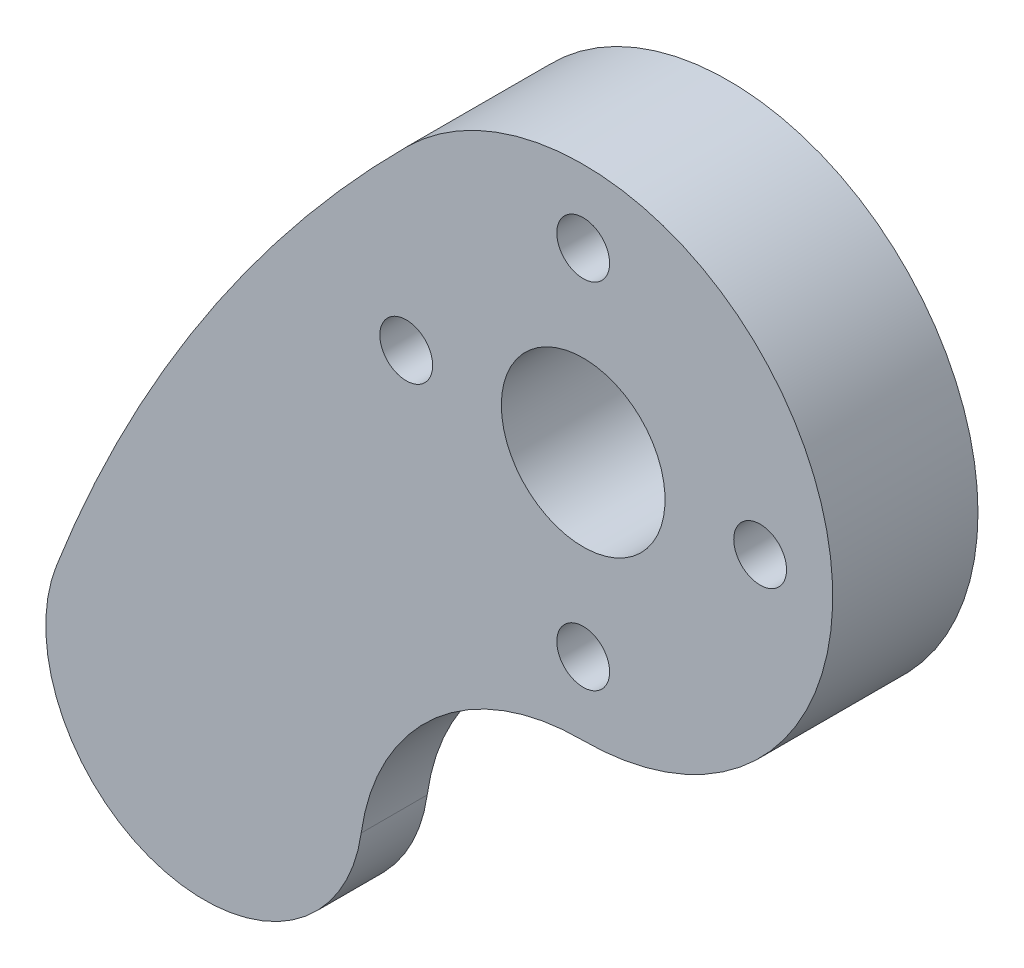
ISO-10303-21;
HEADER;
FILE_DESCRIPTION(('STEP AP214'),'2;1');
FILE_NAME('part.step','',(''),(''),'','','');
FILE_SCHEMA(('AUTOMOTIVE_DESIGN { 1 0 10303 214 1 1 1 1 }'));
ENDSEC;
DATA;
#1=APPLICATION_CONTEXT('core data for automotive mechanical design processes');
#2=APPLICATION_PROTOCOL_DEFINITION('international standard','automotive_design',2000,#1);
#3=PRODUCT_CONTEXT('',#1,'mechanical');
#4=PRODUCT('Part','Part','',(#3));
#5=PRODUCT_RELATED_PRODUCT_CATEGORY('part','',(#4));
#6=PRODUCT_DEFINITION_FORMATION('','',#4);
#7=PRODUCT_DEFINITION_CONTEXT('part definition',#1,'design');
#8=PRODUCT_DEFINITION('design','',#6,#7);
#9=PRODUCT_DEFINITION_SHAPE('','',#8);
#10=(LENGTH_UNIT() NAMED_UNIT(*) SI_UNIT(.MILLI.,.METRE.));
#11=(NAMED_UNIT(*) PLANE_ANGLE_UNIT() SI_UNIT($,.RADIAN.));
#12=(NAMED_UNIT(*) SI_UNIT($,.STERADIAN.) SOLID_ANGLE_UNIT());
#13=UNCERTAINTY_MEASURE_WITH_UNIT(LENGTH_MEASURE(1.E-05),#10,'distance_accuracy_value','');
#14=(GEOMETRIC_REPRESENTATION_CONTEXT(3) GLOBAL_UNCERTAINTY_ASSIGNED_CONTEXT((#13)) GLOBAL_UNIT_ASSIGNED_CONTEXT((#10,
#11,#12)) REPRESENTATION_CONTEXT('',''));
#15=CARTESIAN_POINT('',(0.,0.,0.));
#16=DIRECTION('',(0.,0.,1.));
#17=DIRECTION('',(1.,0.,0.));
#18=AXIS2_PLACEMENT_3D('',#15,#16,#17);
#19=CARTESIAN_POINT('',(0.,0.,3.175));
#20=DIRECTION('',(0.,0.,1.));
#21=DIRECTION('',(1.,0.,0.));
#22=AXIS2_PLACEMENT_3D('',#19,#20,#21);
#23=PLANE('',#22);
#24=CARTESIAN_POINT('',(104.489250000002,43.4974999999998,3.175));
#25=DIRECTION('',(0.,0.,1.));
#26=DIRECTION('',(1.,0.,0.));
#27=AXIS2_PLACEMENT_3D('',#24,#25,#26);
#28=CIRCLE('',#27,1.26999999998563);
#29=CARTESIAN_POINT('',(103.219250000017,43.4974999999998,3.175));
#30=VERTEX_POINT('',#29);
#31=EDGE_CURVE('E141',#30,#30,#28,.T.);
#32=ORIENTED_EDGE('',*,*,#31,.F.);
#33=EDGE_LOOP('',(#32));
#34=FACE_BOUND('',#33,.T.);
#35=CARTESIAN_POINT('',(104.489250000002,60.5154999999998,3.175));
#36=DIRECTION('',(0.,0.,1.));
#37=DIRECTION('',(1.,0.,0.));
#38=AXIS2_PLACEMENT_3D('',#35,#36,#37);
#39=CIRCLE('',#38,1.26999999998563);
#40=CARTESIAN_POINT('',(103.219250000017,60.5154999999998,3.175));
#41=VERTEX_POINT('',#40);
#42=EDGE_CURVE('E135',#41,#41,#39,.T.);
#43=ORIENTED_EDGE('',*,*,#42,.F.);
#44=EDGE_LOOP('',(#43));
#45=FACE_BOUND('',#44,.T.);
#46=CARTESIAN_POINT('',(95.9802500000022,52.0064999999998,3.175));
#47=DIRECTION('',(0.,0.,1.));
#48=DIRECTION('',(1.,0.,0.));
#49=AXIS2_PLACEMENT_3D('',#46,#47,#48);
#50=CIRCLE('',#49,1.26999999998564);
#51=CARTESIAN_POINT('',(94.7102500000166,52.0064999999998,3.175));
#52=VERTEX_POINT('',#51);
#53=EDGE_CURVE('E129',#52,#52,#50,.T.);
#54=ORIENTED_EDGE('',*,*,#53,.F.);
#55=EDGE_LOOP('',(#54));
#56=FACE_BOUND('',#55,.T.);
#57=CARTESIAN_POINT('',(112.998250000002,52.0064999999998,3.175));
#58=DIRECTION('',(0.,0.,1.));
#59=DIRECTION('',(1.,0.,0.));
#60=AXIS2_PLACEMENT_3D('',#57,#58,#59);
#61=CIRCLE('',#60,1.26999999998566);
#62=CARTESIAN_POINT('',(111.728250000017,52.0064999999998,3.175));
#63=VERTEX_POINT('',#62);
#64=EDGE_CURVE('E123',#63,#63,#61,.T.);
#65=ORIENTED_EDGE('',*,*,#64,.F.);
#66=EDGE_LOOP('',(#65));
#67=FACE_BOUND('',#66,.T.);
#68=CARTESIAN_POINT('',(104.489250000002,52.0064999999998,3.175));
#69=DIRECTION('',(0.,0.,1.));
#70=DIRECTION('',(1.,0.,0.));
#71=AXIS2_PLACEMENT_3D('',#68,#69,#70);
#72=CIRCLE('',#71,3.93699999998565);
#73=CARTESIAN_POINT('',(100.552250000017,52.0064999999998,3.175));
#74=VERTEX_POINT('',#73);
#75=EDGE_CURVE('E117',#74,#74,#72,.T.);
#76=ORIENTED_EDGE('',*,*,#75,.F.);
#77=EDGE_LOOP('',(#76));
#78=FACE_BOUND('',#77,.T.);
#79=CARTESIAN_POINT('',(86.267181183115,31.8764422805925,3.175));
#80=DIRECTION('',(0.,0.,1.));
#81=DIRECTION('',(1.,0.,0.));
#82=AXIS2_PLACEMENT_3D('',#79,#80,#81);
#83=CIRCLE('',#82,7.62);
#84=CARTESIAN_POINT('',(79.1569800917538,34.6167781068018,3.175));
#85=VERTEX_POINT('',#84);
#86=CARTESIAN_POINT('',(93.8134639801699,30.8190795486629,3.175));
#87=VERTEX_POINT('',#86);
#88=EDGE_CURVE('E99',#85,#87,#83,.T.);
#89=ORIENTED_EDGE('',*,*,#88,.T.);
#90=CARTESIAN_POINT('',(104.378259896047,29.3387717239614,3.175));
#91=DIRECTION('',(0.,0.,1.));
#92=DIRECTION('',(1.,0.,0.));
#93=AXIS2_PLACEMENT_3D('',#90,#91,#92);
#94=CIRCLE('',#93,10.668);
#95=CARTESIAN_POINT('',(104.430493989438,40.0066438454166,3.175));
#96=VERTEX_POINT('',#95);
#97=EDGE_CURVE('E90',#96,#87,#94,.T.);
#98=ORIENTED_EDGE('',*,*,#97,.F.);
#99=CARTESIAN_POINT('',(104.489250000002,52.0064999999998,3.175));
#100=DIRECTION('',(0.,0.,1.));
#101=DIRECTION('',(1.,0.,0.));
#102=AXIS2_PLACEMENT_3D('',#99,#100,#101);
#103=CIRCLE('',#102,12.);
#104=CARTESIAN_POINT('',(96.0142996751162,60.5020998605583,3.175));
#105=VERTEX_POINT('',#104);
#106=EDGE_CURVE('E86',#96,#105,#103,.T.);
#107=ORIENTED_EDGE('',*,*,#106,.T.);
#108=CARTESIAN_POINT('',(148.495405809727,7.8931215341666,3.175));
#109=DIRECTION('',(0.,0.,1.));
#110=DIRECTION('',(1.,0.,0.));
#111=AXIS2_PLACEMENT_3D('',#108,#109,#110);
#112=CIRCLE('',#111,74.3099663683076);
#113=EDGE_CURVE('E59',#105,#85,#112,.T.);
#114=ORIENTED_EDGE('',*,*,#113,.T.);
#115=EDGE_LOOP('',(#89,#98,#107,#114));
#116=FACE_BOUND('',#115,.T.);
#117=ADVANCED_FACE('F34',(#34,#45,#56,#67,#78,#116),#23,.T.);
#118=CARTESIAN_POINT('',(0.,0.,0.));
#119=DIRECTION('',(0.,0.,1.));
#120=DIRECTION('',(1.,0.,0.));
#121=AXIS2_PLACEMENT_3D('',#118,#119,#120);
#122=PLANE('',#121);
#123=CARTESIAN_POINT('',(104.378259896047,29.3387717239614,0.));
#124=DIRECTION('',(0.,0.,-1.));
#125=DIRECTION('',(-1.,0.,0.));
#126=AXIS2_PLACEMENT_3D('',#123,#124,#125);
#127=CIRCLE('',#126,10.668);
#128=CARTESIAN_POINT('',(93.8134639801699,30.8190795486629,0.));
#129=VERTEX_POINT('',#128);
#130=CARTESIAN_POINT('',(104.430493989438,40.0066438454166,0.));
#131=VERTEX_POINT('',#130);
#132=EDGE_CURVE('E94',#129,#131,#127,.T.);
#133=ORIENTED_EDGE('',*,*,#132,.F.);
#134=CARTESIAN_POINT('',(86.267181183115,31.8764422805925,0.));
#135=DIRECTION('',(0.,0.,1.));
#136=DIRECTION('',(1.,0.,0.));
#137=AXIS2_PLACEMENT_3D('',#134,#135,#136);
#138=CIRCLE('',#137,7.62);
#139=CARTESIAN_POINT('',(79.1569800917538,34.6167781068018,0.));
#140=VERTEX_POINT('',#139);
#141=EDGE_CURVE('E50',#140,#129,#138,.T.);
#142=ORIENTED_EDGE('',*,*,#141,.F.);
#143=CARTESIAN_POINT('',(148.495405809727,7.8931215341666,0.));
#144=DIRECTION('',(0.,0.,1.));
#145=DIRECTION('',(1.,0.,0.));
#146=AXIS2_PLACEMENT_3D('',#143,#144,#145);
#147=CIRCLE('',#146,74.3099663683076);
#148=CARTESIAN_POINT('',(96.0142996751322,60.5020998605423,0.));
#149=VERTEX_POINT('',#148);
#150=EDGE_CURVE('E69',#149,#140,#147,.T.);
#151=ORIENTED_EDGE('',*,*,#150,.F.);
#152=CARTESIAN_POINT('',(104.489250000002,52.0064999999998,0.));
#153=DIRECTION('',(0.,0.,-1.));
#154=DIRECTION('',(-1.,0.,0.));
#155=AXIS2_PLACEMENT_3D('',#152,#153,#154);
#156=CIRCLE('',#155,11.9999999999777);
#157=EDGE_CURVE('E11',#131,#149,#156,.T.);
#158=ORIENTED_EDGE('',*,*,#157,.F.);
#159=EDGE_LOOP('',(#133,#142,#151,#158));
#160=FACE_BOUND('',#159,.T.);
#161=ADVANCED_FACE('F98',(#160),#122,.F.);
#162=CARTESIAN_POINT('',(86.267181183115,31.8764422805925,3.175));
#163=DIRECTION('',(0.,0.,-1.));
#164=DIRECTION('',(-1.,0.,0.));
#165=AXIS2_PLACEMENT_3D('',#162,#163,#164);
#166=CYLINDRICAL_SURFACE('',#165,7.62);
#167=ORIENTED_EDGE('',*,*,#141,.T.);
#168=DIRECTION('',(0.,0.,-1.));
#169=VECTOR('',#168,1.);
#170=CARTESIAN_POINT('',(93.8134639801699,30.8190795486629,3.175025));
#171=LINE('',#170,#169);
#172=EDGE_CURVE('E91',#87,#129,#171,.T.);
#173=ORIENTED_EDGE('',*,*,#172,.F.);
#174=ORIENTED_EDGE('',*,*,#88,.F.);
#175=DIRECTION('',(0.,0.,-1.));
#176=VECTOR('',#175,1.);
#177=CARTESIAN_POINT('',(79.1569800917538,34.6167781068018,3.175));
#178=LINE('',#177,#176);
#179=EDGE_CURVE('E102',#85,#140,#178,.T.);
#180=ORIENTED_EDGE('',*,*,#179,.T.);
#181=EDGE_LOOP('',(#167,#173,#174,#180));
#182=FACE_BOUND('',#181,.T.);
#183=ADVANCED_FACE('F36',(#182),#166,.T.);
#184=CARTESIAN_POINT('',(104.489250000002,52.0064999999998,3.175));
#185=DIRECTION('',(0.,0.,-1.));
#186=DIRECTION('',(-1.,0.,0.));
#187=AXIS2_PLACEMENT_3D('',#184,#185,#186);
#188=CYLINDRICAL_SURFACE('',#187,12.);
#189=ORIENTED_EDGE('',*,*,#106,.F.);
#190=DIRECTION('',(0.,0.,-1.));
#191=VECTOR('',#190,1.);
#192=CARTESIAN_POINT('',(104.430493989438,40.0066438454166,3.175025));
#193=LINE('',#192,#191);
#194=EDGE_CURVE('E82',#96,#131,#193,.T.);
#195=ORIENTED_EDGE('',*,*,#194,.T.);
#196=ORIENTED_EDGE('',*,*,#157,.T.);
#197=DIRECTION('',(0.,0.,-1.));
#198=VECTOR('',#197,1.);
#199=CARTESIAN_POINT('',(96.0142996751162,60.5020998605583,3.175));
#200=LINE('',#199,#198);
#201=EDGE_CURVE('E43',#105,#149,#200,.T.);
#202=ORIENTED_EDGE('',*,*,#201,.F.);
#203=EDGE_LOOP('',(#189,#195,#196,#202));
#204=FACE_BOUND('',#203,.T.);
#205=CARTESIAN_POINT('',(104.489250000002,52.0064999999998,-3.81));
#206=DIRECTION('',(0.,0.,-1.));
#207=DIRECTION('',(-1.,0.,0.));
#208=AXIS2_PLACEMENT_3D('',#205,#206,#207);
#209=CIRCLE('',#208,11.9999999999777);
#210=CARTESIAN_POINT('',(92.4892500000245,52.0064999999998,-3.81));
#211=VERTEX_POINT('',#210);
#212=EDGE_CURVE('E111',#211,#211,#209,.T.);
#213=ORIENTED_EDGE('',*,*,#212,.F.);
#214=EDGE_LOOP('',(#213));
#215=FACE_BOUND('',#214,.T.);
#216=ADVANCED_FACE('F84',(#204,#215),#188,.T.);
#217=CARTESIAN_POINT('',(148.495405809727,7.8931215341666,3.175));
#218=DIRECTION('',(0.,0.,-1.));
#219=DIRECTION('',(-1.,0.,0.));
#220=AXIS2_PLACEMENT_3D('',#217,#218,#219);
#221=CYLINDRICAL_SURFACE('',#220,74.3099663683076);
#222=ORIENTED_EDGE('',*,*,#150,.T.);
#223=ORIENTED_EDGE('',*,*,#179,.F.);
#224=ORIENTED_EDGE('',*,*,#113,.F.);
#225=ORIENTED_EDGE('',*,*,#201,.T.);
#226=EDGE_LOOP('',(#222,#223,#224,#225));
#227=FACE_BOUND('',#226,.T.);
#228=ADVANCED_FACE('F101',(#227),#221,.T.);
#229=CARTESIAN_POINT('',(104.489250000002,52.0064999999998,-3.81));
#230=DIRECTION('',(0.,0.,-1.));
#231=DIRECTION('',(-1.,0.,0.));
#232=AXIS2_PLACEMENT_3D('',#229,#230,#231);
#233=PLANE('',#232);
#234=CARTESIAN_POINT('',(104.489250000002,43.4974999999998,-3.81));
#235=DIRECTION('',(0.,0.,-1.));
#236=DIRECTION('',(-1.,0.,0.));
#237=AXIS2_PLACEMENT_3D('',#234,#235,#236);
#238=CIRCLE('',#237,1.26999999998563);
#239=CARTESIAN_POINT('',(103.219250000017,43.4974999999998,-3.81));
#240=VERTEX_POINT('',#239);
#241=EDGE_CURVE('E144',#240,#240,#238,.T.);
#242=ORIENTED_EDGE('',*,*,#241,.F.);
#243=EDGE_LOOP('',(#242));
#244=FACE_BOUND('',#243,.T.);
#245=CARTESIAN_POINT('',(104.489250000002,60.5154999999998,-3.81));
#246=DIRECTION('',(0.,0.,-1.));
#247=DIRECTION('',(-1.,0.,0.));
#248=AXIS2_PLACEMENT_3D('',#245,#246,#247);
#249=CIRCLE('',#248,1.26999999998563);
#250=CARTESIAN_POINT('',(103.219250000017,60.5154999999998,-3.81));
#251=VERTEX_POINT('',#250);
#252=EDGE_CURVE('E138',#251,#251,#249,.T.);
#253=ORIENTED_EDGE('',*,*,#252,.F.);
#254=EDGE_LOOP('',(#253));
#255=FACE_BOUND('',#254,.T.);
#256=CARTESIAN_POINT('',(95.9802500000022,52.0064999999998,-3.81));
#257=DIRECTION('',(0.,0.,-1.));
#258=DIRECTION('',(-1.,0.,0.));
#259=AXIS2_PLACEMENT_3D('',#256,#257,#258);
#260=CIRCLE('',#259,1.26999999998564);
#261=CARTESIAN_POINT('',(94.7102500000166,52.0064999999998,-3.81));
#262=VERTEX_POINT('',#261);
#263=EDGE_CURVE('E132',#262,#262,#260,.T.);
#264=ORIENTED_EDGE('',*,*,#263,.F.);
#265=EDGE_LOOP('',(#264));
#266=FACE_BOUND('',#265,.T.);
#267=CARTESIAN_POINT('',(112.998250000002,52.0064999999998,-3.81));
#268=DIRECTION('',(0.,0.,-1.));
#269=DIRECTION('',(-1.,0.,0.));
#270=AXIS2_PLACEMENT_3D('',#267,#268,#269);
#271=CIRCLE('',#270,1.26999999998566);
#272=CARTESIAN_POINT('',(111.728250000017,52.0064999999998,-3.81));
#273=VERTEX_POINT('',#272);
#274=EDGE_CURVE('E126',#273,#273,#271,.T.);
#275=ORIENTED_EDGE('',*,*,#274,.F.);
#276=EDGE_LOOP('',(#275));
#277=FACE_BOUND('',#276,.T.);
#278=CARTESIAN_POINT('',(104.489250000002,52.0064999999998,-3.81));
#279=DIRECTION('',(0.,0.,-1.));
#280=DIRECTION('',(-1.,0.,0.));
#281=AXIS2_PLACEMENT_3D('',#278,#279,#280);
#282=CIRCLE('',#281,3.93699999998565);
#283=CARTESIAN_POINT('',(100.552250000017,52.0064999999998,-3.81));
#284=VERTEX_POINT('',#283);
#285=EDGE_CURVE('E120',#284,#284,#282,.T.);
#286=ORIENTED_EDGE('',*,*,#285,.F.);
#287=EDGE_LOOP('',(#286));
#288=FACE_BOUND('',#287,.T.);
#289=ORIENTED_EDGE('',*,*,#212,.T.);
#290=EDGE_LOOP('',(#289));
#291=FACE_BOUND('',#290,.T.);
#292=ADVANCED_FACE('F160',(#244,#255,#266,#277,#288,#291),#233,.T.);
#293=CARTESIAN_POINT('',(104.489250000002,52.0064999999998,3.175025));
#294=DIRECTION('',(0.,0.,-1.));
#295=DIRECTION('',(-1.,0.,0.));
#296=AXIS2_PLACEMENT_3D('',#293,#294,#295);
#297=CYLINDRICAL_SURFACE('',#296,3.93699999998565);
#298=CARTESIAN_POINT('',(100.552250000017,52.0064999999998,3.175));
#299=CARTESIAN_POINT('',(100.552250000017,52.0064999999998,3.10223958333333));
#300=CARTESIAN_POINT('',(100.552250000017,52.0064999999998,3.02947916666667));
#301=CARTESIAN_POINT('',(100.552250000017,52.0064999999998,2.88395833333333));
#302=CARTESIAN_POINT('',(100.552250000017,52.0064999999998,2.81119791666667));
#303=CARTESIAN_POINT('',(100.552250000017,52.0064999999998,2.66567708333333));
#304=CARTESIAN_POINT('',(100.552250000017,52.0064999999998,2.59291666666667));
#305=CARTESIAN_POINT('',(100.552250000017,52.0064999999998,2.44739583333333));
#306=CARTESIAN_POINT('',(100.552250000017,52.0064999999998,2.37463541666667));
#307=CARTESIAN_POINT('',(100.552250000017,52.0064999999998,2.22911458333333));
#308=CARTESIAN_POINT('',(100.552250000017,52.0064999999998,2.15635416666667));
#309=CARTESIAN_POINT('',(100.552250000017,52.0064999999998,2.01083333333333));
#310=CARTESIAN_POINT('',(100.552250000017,52.0064999999998,1.93807291666667));
#311=CARTESIAN_POINT('',(100.552250000017,52.0064999999998,1.79255208333333));
#312=CARTESIAN_POINT('',(100.552250000017,52.0064999999998,1.71979166666667));
#313=CARTESIAN_POINT('',(100.552250000017,52.0064999999998,1.57427083333333));
#314=CARTESIAN_POINT('',(100.552250000017,52.0064999999998,1.50151041666667));
#315=CARTESIAN_POINT('',(100.552250000017,52.0064999999998,1.35598958333333));
#316=CARTESIAN_POINT('',(100.552250000017,52.0064999999998,1.28322916666667));
#317=CARTESIAN_POINT('',(100.552250000017,52.0064999999998,1.13770833333333));
#318=CARTESIAN_POINT('',(100.552250000017,52.0064999999998,1.06494791666667));
#319=CARTESIAN_POINT('',(100.552250000017,52.0064999999998,0.919427083333334));
#320=CARTESIAN_POINT('',(100.552250000017,52.0064999999998,0.846666666666667));
#321=CARTESIAN_POINT('',(100.552250000017,52.0064999999998,0.701145833333334));
#322=CARTESIAN_POINT('',(100.552250000017,52.0064999999998,0.628385416666667));
#323=CARTESIAN_POINT('',(100.552250000017,52.0064999999998,0.482864583333334));
#324=CARTESIAN_POINT('',(100.552250000017,52.0064999999998,0.410104166666667));
#325=CARTESIAN_POINT('',(100.552250000017,52.0064999999998,0.264583333333334));
#326=CARTESIAN_POINT('',(100.552250000017,52.0064999999998,0.191822916666667));
#327=CARTESIAN_POINT('',(100.552250000017,52.0064999999998,0.0463020833333337));
#328=CARTESIAN_POINT('',(100.552250000017,52.0064999999998,-0.0264583333333329));
#329=CARTESIAN_POINT('',(100.552250000017,52.0064999999998,-0.171979166666666));
#330=CARTESIAN_POINT('',(100.552250000017,52.0064999999998,-0.244739583333333));
#331=CARTESIAN_POINT('',(100.552250000017,52.0064999999998,-0.390260416666666));
#332=CARTESIAN_POINT('',(100.552250000017,52.0064999999998,-0.463020833333333));
#333=CARTESIAN_POINT('',(100.552250000017,52.0064999999998,-0.608541666666666));
#334=CARTESIAN_POINT('',(100.552250000017,52.0064999999998,-0.681302083333333));
#335=CARTESIAN_POINT('',(100.552250000017,52.0064999999998,-0.826822916666666));
#336=CARTESIAN_POINT('',(100.552250000017,52.0064999999998,-0.899583333333332));
#337=CARTESIAN_POINT('',(100.552250000017,52.0064999999998,-1.04510416666667));
#338=CARTESIAN_POINT('',(100.552250000017,52.0064999999998,-1.11786458333333));
#339=CARTESIAN_POINT('',(100.552250000017,52.0064999999998,-1.26338541666667));
#340=CARTESIAN_POINT('',(100.552250000017,52.0064999999998,-1.33614583333333));
#341=CARTESIAN_POINT('',(100.552250000017,52.0064999999998,-1.48166666666667));
#342=CARTESIAN_POINT('',(100.552250000017,52.0064999999998,-1.55442708333333));
#343=CARTESIAN_POINT('',(100.552250000017,52.0064999999998,-1.69994791666667));
#344=CARTESIAN_POINT('',(100.552250000017,52.0064999999998,-1.77270833333333));
#345=CARTESIAN_POINT('',(100.552250000017,52.0064999999998,-1.91822916666667));
#346=CARTESIAN_POINT('',(100.552250000017,52.0064999999998,-1.99098958333333));
#347=CARTESIAN_POINT('',(100.552250000017,52.0064999999998,-2.13651041666667));
#348=CARTESIAN_POINT('',(100.552250000017,52.0064999999998,-2.20927083333333));
#349=CARTESIAN_POINT('',(100.552250000017,52.0064999999998,-2.35479166666667));
#350=CARTESIAN_POINT('',(100.552250000017,52.0064999999998,-2.42755208333333));
#351=CARTESIAN_POINT('',(100.552250000017,52.0064999999998,-2.57307291666667));
#352=CARTESIAN_POINT('',(100.552250000017,52.0064999999998,-2.64583333333333));
#353=CARTESIAN_POINT('',(100.552250000017,52.0064999999998,-2.79135416666667));
#354=CARTESIAN_POINT('',(100.552250000017,52.0064999999998,-2.86411458333333));
#355=CARTESIAN_POINT('',(100.552250000017,52.0064999999998,-3.00963541666667));
#356=CARTESIAN_POINT('',(100.552250000017,52.0064999999998,-3.08239583333333));
#357=CARTESIAN_POINT('',(100.552250000017,52.0064999999998,-3.22791666666667));
#358=CARTESIAN_POINT('',(100.552250000017,52.0064999999998,-3.30067708333333));
#359=CARTESIAN_POINT('',(100.552250000017,52.0064999999998,-3.44619791666666));
#360=CARTESIAN_POINT('',(100.552250000017,52.0064999999998,-3.51895833333333));
#361=CARTESIAN_POINT('',(100.552250000017,52.0064999999998,-3.66447916666667));
#362=CARTESIAN_POINT('',(100.552250000017,52.0064999999998,-3.73723958333333));
#363=CARTESIAN_POINT('',(100.552250000017,52.0064999999998,-3.81));
#364=B_SPLINE_CURVE_WITH_KNOTS('',3,(#298,#299,#300,#301,#302,#303,#304,#305,#306,#307,#308,
#309,#310,#311,#312,#313,#314,#315,#316,#317,#318,#319,#320,#321,#322,#323,#324,#325,#326,#327,
#328,#329,#330,#331,#332,#333,#334,#335,#336,#337,#338,#339,#340,#341,#342,#343,#344,#345,#346,
#347,#348,#349,#350,#351,#352,#353,#354,#355,#356,#357,#358,#359,#360,#361,#362,#363),
.UNSPECIFIED.,.F.,.F.,(4,2,2,2,2,2,2,2,2,2,2,2,2,2,2,2,2,2,2,2,2,2,2,2,2,2,2,2,2,2,2,2,4),(0.,
0.21828125,0.4365625,0.65484375,0.873124999999999,1.09140625,1.3096875,1.52796875,1.74625,
1.96453125,2.1828125,2.40109375,2.619375,2.83765625,3.0559375,3.27421875,3.4925,3.71078125,
3.9290625,4.14734375,4.365625,4.58390625,4.8021875,5.02046875,5.23875,5.45703125,5.6753125,
5.89359375,6.111875,6.33015625,6.5484375,6.76671875,6.985),.UNSPECIFIED.);
#365=EDGE_CURVE('BSEAM214',#74,#284,#364,.T.);
#366=ORIENTED_EDGE('',*,*,#75,.T.);
#367=ORIENTED_EDGE('',*,*,#285,.T.);
#368=ORIENTED_EDGE('',*,*,#365,.T.);
#369=ORIENTED_EDGE('',*,*,#365,.F.);
#370=EDGE_LOOP('',(#366,#368,#367,#369));
#371=FACE_BOUND('',#370,.T.);
#372=ADVANCED_FACE('F214',(#371),#297,.F.);
#373=CARTESIAN_POINT('',(112.998250000002,52.0064999999998,3.175025));
#374=DIRECTION('',(0.,0.,-1.));
#375=DIRECTION('',(-1.,0.,0.));
#376=AXIS2_PLACEMENT_3D('',#373,#374,#375);
#377=CYLINDRICAL_SURFACE('',#376,1.26999999998566);
#378=CARTESIAN_POINT('',(111.728250000017,52.0064999999998,3.175));
#379=CARTESIAN_POINT('',(111.728250000017,52.0064999999998,3.10223958333333));
#380=CARTESIAN_POINT('',(111.728250000017,52.0064999999998,3.02947916666667));
#381=CARTESIAN_POINT('',(111.728250000017,52.0064999999998,2.88395833333333));
#382=CARTESIAN_POINT('',(111.728250000017,52.0064999999998,2.81119791666667));
#383=CARTESIAN_POINT('',(111.728250000017,52.0064999999998,2.66567708333333));
#384=CARTESIAN_POINT('',(111.728250000017,52.0064999999998,2.59291666666667));
#385=CARTESIAN_POINT('',(111.728250000017,52.0064999999998,2.44739583333333));
#386=CARTESIAN_POINT('',(111.728250000017,52.0064999999998,2.37463541666667));
#387=CARTESIAN_POINT('',(111.728250000017,52.0064999999998,2.22911458333333));
#388=CARTESIAN_POINT('',(111.728250000017,52.0064999999998,2.15635416666667));
#389=CARTESIAN_POINT('',(111.728250000017,52.0064999999998,2.01083333333333));
#390=CARTESIAN_POINT('',(111.728250000017,52.0064999999998,1.93807291666667));
#391=CARTESIAN_POINT('',(111.728250000017,52.0064999999998,1.79255208333333));
#392=CARTESIAN_POINT('',(111.728250000017,52.0064999999998,1.71979166666667));
#393=CARTESIAN_POINT('',(111.728250000017,52.0064999999998,1.57427083333333));
#394=CARTESIAN_POINT('',(111.728250000017,52.0064999999998,1.50151041666667));
#395=CARTESIAN_POINT('',(111.728250000017,52.0064999999998,1.35598958333333));
#396=CARTESIAN_POINT('',(111.728250000017,52.0064999999998,1.28322916666667));
#397=CARTESIAN_POINT('',(111.728250000017,52.0064999999998,1.13770833333333));
#398=CARTESIAN_POINT('',(111.728250000017,52.0064999999998,1.06494791666667));
#399=CARTESIAN_POINT('',(111.728250000017,52.0064999999998,0.919427083333334));
#400=CARTESIAN_POINT('',(111.728250000017,52.0064999999998,0.846666666666667));
#401=CARTESIAN_POINT('',(111.728250000017,52.0064999999998,0.701145833333334));
#402=CARTESIAN_POINT('',(111.728250000017,52.0064999999998,0.628385416666667));
#403=CARTESIAN_POINT('',(111.728250000017,52.0064999999998,0.482864583333334));
#404=CARTESIAN_POINT('',(111.728250000017,52.0064999999998,0.410104166666667));
#405=CARTESIAN_POINT('',(111.728250000017,52.0064999999998,0.264583333333334));
#406=CARTESIAN_POINT('',(111.728250000017,52.0064999999998,0.191822916666667));
#407=CARTESIAN_POINT('',(111.728250000017,52.0064999999998,0.0463020833333337));
#408=CARTESIAN_POINT('',(111.728250000017,52.0064999999998,-0.0264583333333329));
#409=CARTESIAN_POINT('',(111.728250000017,52.0064999999998,-0.171979166666666));
#410=CARTESIAN_POINT('',(111.728250000017,52.0064999999998,-0.244739583333333));
#411=CARTESIAN_POINT('',(111.728250000017,52.0064999999998,-0.390260416666666));
#412=CARTESIAN_POINT('',(111.728250000017,52.0064999999998,-0.463020833333333));
#413=CARTESIAN_POINT('',(111.728250000017,52.0064999999998,-0.608541666666666));
#414=CARTESIAN_POINT('',(111.728250000017,52.0064999999998,-0.681302083333333));
#415=CARTESIAN_POINT('',(111.728250000017,52.0064999999998,-0.826822916666666));
#416=CARTESIAN_POINT('',(111.728250000017,52.0064999999998,-0.899583333333332));
#417=CARTESIAN_POINT('',(111.728250000017,52.0064999999998,-1.04510416666667));
#418=CARTESIAN_POINT('',(111.728250000017,52.0064999999998,-1.11786458333333));
#419=CARTESIAN_POINT('',(111.728250000017,52.0064999999998,-1.26338541666667));
#420=CARTESIAN_POINT('',(111.728250000017,52.0064999999998,-1.33614583333333));
#421=CARTESIAN_POINT('',(111.728250000017,52.0064999999998,-1.48166666666667));
#422=CARTESIAN_POINT('',(111.728250000017,52.0064999999998,-1.55442708333333));
#423=CARTESIAN_POINT('',(111.728250000017,52.0064999999998,-1.69994791666667));
#424=CARTESIAN_POINT('',(111.728250000017,52.0064999999998,-1.77270833333333));
#425=CARTESIAN_POINT('',(111.728250000017,52.0064999999998,-1.91822916666667));
#426=CARTESIAN_POINT('',(111.728250000017,52.0064999999998,-1.99098958333333));
#427=CARTESIAN_POINT('',(111.728250000017,52.0064999999998,-2.13651041666667));
#428=CARTESIAN_POINT('',(111.728250000017,52.0064999999998,-2.20927083333333));
#429=CARTESIAN_POINT('',(111.728250000017,52.0064999999998,-2.35479166666667));
#430=CARTESIAN_POINT('',(111.728250000017,52.0064999999998,-2.42755208333333));
#431=CARTESIAN_POINT('',(111.728250000017,52.0064999999998,-2.57307291666667));
#432=CARTESIAN_POINT('',(111.728250000017,52.0064999999998,-2.64583333333333));
#433=CARTESIAN_POINT('',(111.728250000017,52.0064999999998,-2.79135416666667));
#434=CARTESIAN_POINT('',(111.728250000017,52.0064999999998,-2.86411458333333));
#435=CARTESIAN_POINT('',(111.728250000017,52.0064999999998,-3.00963541666667));
#436=CARTESIAN_POINT('',(111.728250000017,52.0064999999998,-3.08239583333333));
#437=CARTESIAN_POINT('',(111.728250000017,52.0064999999998,-3.22791666666667));
#438=CARTESIAN_POINT('',(111.728250000017,52.0064999999998,-3.30067708333333));
#439=CARTESIAN_POINT('',(111.728250000017,52.0064999999998,-3.44619791666666));
#440=CARTESIAN_POINT('',(111.728250000017,52.0064999999998,-3.51895833333333));
#441=CARTESIAN_POINT('',(111.728250000017,52.0064999999998,-3.66447916666667));
#442=CARTESIAN_POINT('',(111.728250000017,52.0064999999998,-3.73723958333333));
#443=CARTESIAN_POINT('',(111.728250000017,52.0064999999998,-3.81));
#444=B_SPLINE_CURVE_WITH_KNOTS('',3,(#378,#379,#380,#381,#382,#383,#384,#385,#386,#387,#388,
#389,#390,#391,#392,#393,#394,#395,#396,#397,#398,#399,#400,#401,#402,#403,#404,#405,#406,#407,
#408,#409,#410,#411,#412,#413,#414,#415,#416,#417,#418,#419,#420,#421,#422,#423,#424,#425,#426,
#427,#428,#429,#430,#431,#432,#433,#434,#435,#436,#437,#438,#439,#440,#441,#442,#443),
.UNSPECIFIED.,.F.,.F.,(4,2,2,2,2,2,2,2,2,2,2,2,2,2,2,2,2,2,2,2,2,2,2,2,2,2,2,2,2,2,2,2,4),(0.,
0.21828125,0.4365625,0.65484375,0.873124999999999,1.09140625,1.3096875,1.52796875,1.74625,
1.96453125,2.1828125,2.40109375,2.619375,2.83765625,3.0559375,3.27421875,3.4925,3.71078125,
3.9290625,4.14734375,4.365625,4.58390625,4.8021875,5.02046875,5.23875,5.45703125,5.6753125,
5.89359375,6.111875,6.33015625,6.5484375,6.76671875,6.985),.UNSPECIFIED.);
#445=EDGE_CURVE('BSEAM206',#63,#273,#444,.T.);
#446=ORIENTED_EDGE('',*,*,#64,.T.);
#447=ORIENTED_EDGE('',*,*,#274,.T.);
#448=ORIENTED_EDGE('',*,*,#445,.T.);
#449=ORIENTED_EDGE('',*,*,#445,.F.);
#450=EDGE_LOOP('',(#446,#448,#447,#449));
#451=FACE_BOUND('',#450,.T.);
#452=ADVANCED_FACE('F206',(#451),#377,.F.);
#453=CARTESIAN_POINT('',(95.9802500000022,52.0064999999998,3.175025));
#454=DIRECTION('',(0.,0.,-1.));
#455=DIRECTION('',(-1.,0.,0.));
#456=AXIS2_PLACEMENT_3D('',#453,#454,#455);
#457=CYLINDRICAL_SURFACE('',#456,1.26999999998564);
#458=CARTESIAN_POINT('',(94.7102500000166,52.0064999999998,3.175));
#459=CARTESIAN_POINT('',(94.7102500000166,52.0064999999998,3.10223958333333));
#460=CARTESIAN_POINT('',(94.7102500000166,52.0064999999998,3.02947916666667));
#461=CARTESIAN_POINT('',(94.7102500000166,52.0064999999998,2.88395833333333));
#462=CARTESIAN_POINT('',(94.7102500000166,52.0064999999998,2.81119791666667));
#463=CARTESIAN_POINT('',(94.7102500000166,52.0064999999998,2.66567708333333));
#464=CARTESIAN_POINT('',(94.7102500000166,52.0064999999998,2.59291666666667));
#465=CARTESIAN_POINT('',(94.7102500000166,52.0064999999998,2.44739583333333));
#466=CARTESIAN_POINT('',(94.7102500000166,52.0064999999998,2.37463541666667));
#467=CARTESIAN_POINT('',(94.7102500000166,52.0064999999998,2.22911458333333));
#468=CARTESIAN_POINT('',(94.7102500000166,52.0064999999998,2.15635416666667));
#469=CARTESIAN_POINT('',(94.7102500000166,52.0064999999998,2.01083333333333));
#470=CARTESIAN_POINT('',(94.7102500000166,52.0064999999998,1.93807291666667));
#471=CARTESIAN_POINT('',(94.7102500000166,52.0064999999998,1.79255208333333));
#472=CARTESIAN_POINT('',(94.7102500000166,52.0064999999998,1.71979166666667));
#473=CARTESIAN_POINT('',(94.7102500000166,52.0064999999998,1.57427083333333));
#474=CARTESIAN_POINT('',(94.7102500000166,52.0064999999998,1.50151041666667));
#475=CARTESIAN_POINT('',(94.7102500000166,52.0064999999998,1.35598958333333));
#476=CARTESIAN_POINT('',(94.7102500000166,52.0064999999998,1.28322916666667));
#477=CARTESIAN_POINT('',(94.7102500000166,52.0064999999998,1.13770833333333));
#478=CARTESIAN_POINT('',(94.7102500000166,52.0064999999998,1.06494791666667));
#479=CARTESIAN_POINT('',(94.7102500000166,52.0064999999998,0.919427083333334));
#480=CARTESIAN_POINT('',(94.7102500000166,52.0064999999998,0.846666666666667));
#481=CARTESIAN_POINT('',(94.7102500000166,52.0064999999998,0.701145833333334));
#482=CARTESIAN_POINT('',(94.7102500000166,52.0064999999998,0.628385416666667));
#483=CARTESIAN_POINT('',(94.7102500000166,52.0064999999998,0.482864583333334));
#484=CARTESIAN_POINT('',(94.7102500000166,52.0064999999998,0.410104166666667));
#485=CARTESIAN_POINT('',(94.7102500000166,52.0064999999998,0.264583333333334));
#486=CARTESIAN_POINT('',(94.7102500000166,52.0064999999998,0.191822916666667));
#487=CARTESIAN_POINT('',(94.7102500000166,52.0064999999998,0.0463020833333337));
#488=CARTESIAN_POINT('',(94.7102500000166,52.0064999999998,-0.0264583333333329));
#489=CARTESIAN_POINT('',(94.7102500000166,52.0064999999998,-0.171979166666666));
#490=CARTESIAN_POINT('',(94.7102500000166,52.0064999999998,-0.244739583333333));
#491=CARTESIAN_POINT('',(94.7102500000166,52.0064999999998,-0.390260416666666));
#492=CARTESIAN_POINT('',(94.7102500000166,52.0064999999998,-0.463020833333333));
#493=CARTESIAN_POINT('',(94.7102500000166,52.0064999999998,-0.608541666666666));
#494=CARTESIAN_POINT('',(94.7102500000166,52.0064999999998,-0.681302083333333));
#495=CARTESIAN_POINT('',(94.7102500000166,52.0064999999998,-0.826822916666666));
#496=CARTESIAN_POINT('',(94.7102500000166,52.0064999999998,-0.899583333333332));
#497=CARTESIAN_POINT('',(94.7102500000166,52.0064999999998,-1.04510416666667));
#498=CARTESIAN_POINT('',(94.7102500000166,52.0064999999998,-1.11786458333333));
#499=CARTESIAN_POINT('',(94.7102500000166,52.0064999999998,-1.26338541666667));
#500=CARTESIAN_POINT('',(94.7102500000166,52.0064999999998,-1.33614583333333));
#501=CARTESIAN_POINT('',(94.7102500000166,52.0064999999998,-1.48166666666667));
#502=CARTESIAN_POINT('',(94.7102500000166,52.0064999999998,-1.55442708333333));
#503=CARTESIAN_POINT('',(94.7102500000166,52.0064999999998,-1.69994791666667));
#504=CARTESIAN_POINT('',(94.7102500000166,52.0064999999998,-1.77270833333333));
#505=CARTESIAN_POINT('',(94.7102500000166,52.0064999999998,-1.91822916666667));
#506=CARTESIAN_POINT('',(94.7102500000166,52.0064999999998,-1.99098958333333));
#507=CARTESIAN_POINT('',(94.7102500000166,52.0064999999998,-2.13651041666667));
#508=CARTESIAN_POINT('',(94.7102500000166,52.0064999999998,-2.20927083333333));
#509=CARTESIAN_POINT('',(94.7102500000166,52.0064999999998,-2.35479166666667));
#510=CARTESIAN_POINT('',(94.7102500000166,52.0064999999998,-2.42755208333333));
#511=CARTESIAN_POINT('',(94.7102500000166,52.0064999999998,-2.57307291666667));
#512=CARTESIAN_POINT('',(94.7102500000166,52.0064999999998,-2.64583333333333));
#513=CARTESIAN_POINT('',(94.7102500000166,52.0064999999998,-2.79135416666667));
#514=CARTESIAN_POINT('',(94.7102500000166,52.0064999999998,-2.86411458333333));
#515=CARTESIAN_POINT('',(94.7102500000166,52.0064999999998,-3.00963541666667));
#516=CARTESIAN_POINT('',(94.7102500000166,52.0064999999998,-3.08239583333333));
#517=CARTESIAN_POINT('',(94.7102500000166,52.0064999999998,-3.22791666666667));
#518=CARTESIAN_POINT('',(94.7102500000166,52.0064999999998,-3.30067708333333));
#519=CARTESIAN_POINT('',(94.7102500000166,52.0064999999998,-3.44619791666666));
#520=CARTESIAN_POINT('',(94.7102500000166,52.0064999999998,-3.51895833333333));
#521=CARTESIAN_POINT('',(94.7102500000166,52.0064999999998,-3.66447916666667));
#522=CARTESIAN_POINT('',(94.7102500000166,52.0064999999998,-3.73723958333333));
#523=CARTESIAN_POINT('',(94.7102500000166,52.0064999999998,-3.81));
#524=B_SPLINE_CURVE_WITH_KNOTS('',3,(#458,#459,#460,#461,#462,#463,#464,#465,#466,#467,#468,
#469,#470,#471,#472,#473,#474,#475,#476,#477,#478,#479,#480,#481,#482,#483,#484,#485,#486,#487,
#488,#489,#490,#491,#492,#493,#494,#495,#496,#497,#498,#499,#500,#501,#502,#503,#504,#505,#506,
#507,#508,#509,#510,#511,#512,#513,#514,#515,#516,#517,#518,#519,#520,#521,#522,#523),
.UNSPECIFIED.,.F.,.F.,(4,2,2,2,2,2,2,2,2,2,2,2,2,2,2,2,2,2,2,2,2,2,2,2,2,2,2,2,2,2,2,2,4),(0.,
0.21828125,0.4365625,0.65484375,0.873124999999999,1.09140625,1.3096875,1.52796875,1.74625,
1.96453125,2.1828125,2.40109375,2.619375,2.83765625,3.0559375,3.27421875,3.4925,3.71078125,
3.9290625,4.14734375,4.365625,4.58390625,4.8021875,5.02046875,5.23875,5.45703125,5.6753125,
5.89359375,6.111875,6.33015625,6.5484375,6.76671875,6.985),.UNSPECIFIED.);
#525=EDGE_CURVE('BSEAM198',#52,#262,#524,.T.);
#526=ORIENTED_EDGE('',*,*,#53,.T.);
#527=ORIENTED_EDGE('',*,*,#263,.T.);
#528=ORIENTED_EDGE('',*,*,#525,.T.);
#529=ORIENTED_EDGE('',*,*,#525,.F.);
#530=EDGE_LOOP('',(#526,#528,#527,#529));
#531=FACE_BOUND('',#530,.T.);
#532=ADVANCED_FACE('F198',(#531),#457,.F.);
#533=CARTESIAN_POINT('',(104.489250000002,60.5154999999998,3.175025));
#534=DIRECTION('',(0.,0.,-1.));
#535=DIRECTION('',(-1.,0.,0.));
#536=AXIS2_PLACEMENT_3D('',#533,#534,#535);
#537=CYLINDRICAL_SURFACE('',#536,1.26999999998563);
#538=CARTESIAN_POINT('',(103.219250000017,60.5154999999998,3.175));
#539=CARTESIAN_POINT('',(103.219250000017,60.5154999999998,3.10223958333333));
#540=CARTESIAN_POINT('',(103.219250000017,60.5154999999998,3.02947916666667));
#541=CARTESIAN_POINT('',(103.219250000017,60.5154999999998,2.88395833333333));
#542=CARTESIAN_POINT('',(103.219250000017,60.5154999999998,2.81119791666667));
#543=CARTESIAN_POINT('',(103.219250000017,60.5154999999998,2.66567708333333));
#544=CARTESIAN_POINT('',(103.219250000017,60.5154999999998,2.59291666666667));
#545=CARTESIAN_POINT('',(103.219250000017,60.5154999999998,2.44739583333333));
#546=CARTESIAN_POINT('',(103.219250000017,60.5154999999998,2.37463541666667));
#547=CARTESIAN_POINT('',(103.219250000017,60.5154999999998,2.22911458333333));
#548=CARTESIAN_POINT('',(103.219250000017,60.5154999999998,2.15635416666667));
#549=CARTESIAN_POINT('',(103.219250000017,60.5154999999998,2.01083333333333));
#550=CARTESIAN_POINT('',(103.219250000017,60.5154999999998,1.93807291666667));
#551=CARTESIAN_POINT('',(103.219250000017,60.5154999999998,1.79255208333333));
#552=CARTESIAN_POINT('',(103.219250000017,60.5154999999998,1.71979166666667));
#553=CARTESIAN_POINT('',(103.219250000017,60.5154999999998,1.57427083333333));
#554=CARTESIAN_POINT('',(103.219250000017,60.5154999999998,1.50151041666667));
#555=CARTESIAN_POINT('',(103.219250000017,60.5154999999998,1.35598958333333));
#556=CARTESIAN_POINT('',(103.219250000017,60.5154999999998,1.28322916666667));
#557=CARTESIAN_POINT('',(103.219250000017,60.5154999999998,1.13770833333333));
#558=CARTESIAN_POINT('',(103.219250000017,60.5154999999998,1.06494791666667));
#559=CARTESIAN_POINT('',(103.219250000017,60.5154999999998,0.919427083333334));
#560=CARTESIAN_POINT('',(103.219250000017,60.5154999999998,0.846666666666667));
#561=CARTESIAN_POINT('',(103.219250000017,60.5154999999998,0.701145833333334));
#562=CARTESIAN_POINT('',(103.219250000017,60.5154999999998,0.628385416666667));
#563=CARTESIAN_POINT('',(103.219250000017,60.5154999999998,0.482864583333334));
#564=CARTESIAN_POINT('',(103.219250000017,60.5154999999998,0.410104166666667));
#565=CARTESIAN_POINT('',(103.219250000017,60.5154999999998,0.264583333333334));
#566=CARTESIAN_POINT('',(103.219250000017,60.5154999999998,0.191822916666667));
#567=CARTESIAN_POINT('',(103.219250000017,60.5154999999998,0.0463020833333337));
#568=CARTESIAN_POINT('',(103.219250000017,60.5154999999998,-0.0264583333333329));
#569=CARTESIAN_POINT('',(103.219250000017,60.5154999999998,-0.171979166666666));
#570=CARTESIAN_POINT('',(103.219250000017,60.5154999999998,-0.244739583333333));
#571=CARTESIAN_POINT('',(103.219250000017,60.5154999999998,-0.390260416666666));
#572=CARTESIAN_POINT('',(103.219250000017,60.5154999999998,-0.463020833333333));
#573=CARTESIAN_POINT('',(103.219250000017,60.5154999999998,-0.608541666666666));
#574=CARTESIAN_POINT('',(103.219250000017,60.5154999999998,-0.681302083333333));
#575=CARTESIAN_POINT('',(103.219250000017,60.5154999999998,-0.826822916666666));
#576=CARTESIAN_POINT('',(103.219250000017,60.5154999999998,-0.899583333333332));
#577=CARTESIAN_POINT('',(103.219250000017,60.5154999999998,-1.04510416666667));
#578=CARTESIAN_POINT('',(103.219250000017,60.5154999999998,-1.11786458333333));
#579=CARTESIAN_POINT('',(103.219250000017,60.5154999999998,-1.26338541666667));
#580=CARTESIAN_POINT('',(103.219250000017,60.5154999999998,-1.33614583333333));
#581=CARTESIAN_POINT('',(103.219250000017,60.5154999999998,-1.48166666666667));
#582=CARTESIAN_POINT('',(103.219250000017,60.5154999999998,-1.55442708333333));
#583=CARTESIAN_POINT('',(103.219250000017,60.5154999999998,-1.69994791666667));
#584=CARTESIAN_POINT('',(103.219250000017,60.5154999999998,-1.77270833333333));
#585=CARTESIAN_POINT('',(103.219250000017,60.5154999999998,-1.91822916666667));
#586=CARTESIAN_POINT('',(103.219250000017,60.5154999999998,-1.99098958333333));
#587=CARTESIAN_POINT('',(103.219250000017,60.5154999999998,-2.13651041666667));
#588=CARTESIAN_POINT('',(103.219250000017,60.5154999999998,-2.20927083333333));
#589=CARTESIAN_POINT('',(103.219250000017,60.5154999999998,-2.35479166666667));
#590=CARTESIAN_POINT('',(103.219250000017,60.5154999999998,-2.42755208333333));
#591=CARTESIAN_POINT('',(103.219250000017,60.5154999999998,-2.57307291666667));
#592=CARTESIAN_POINT('',(103.219250000017,60.5154999999998,-2.64583333333333));
#593=CARTESIAN_POINT('',(103.219250000017,60.5154999999998,-2.79135416666667));
#594=CARTESIAN_POINT('',(103.219250000017,60.5154999999998,-2.86411458333333));
#595=CARTESIAN_POINT('',(103.219250000017,60.5154999999998,-3.00963541666667));
#596=CARTESIAN_POINT('',(103.219250000017,60.5154999999998,-3.08239583333333));
#597=CARTESIAN_POINT('',(103.219250000017,60.5154999999998,-3.22791666666667));
#598=CARTESIAN_POINT('',(103.219250000017,60.5154999999998,-3.30067708333333));
#599=CARTESIAN_POINT('',(103.219250000017,60.5154999999998,-3.44619791666666));
#600=CARTESIAN_POINT('',(103.219250000017,60.5154999999998,-3.51895833333333));
#601=CARTESIAN_POINT('',(103.219250000017,60.5154999999998,-3.66447916666667));
#602=CARTESIAN_POINT('',(103.219250000017,60.5154999999998,-3.73723958333333));
#603=CARTESIAN_POINT('',(103.219250000017,60.5154999999998,-3.81));
#604=B_SPLINE_CURVE_WITH_KNOTS('',3,(#538,#539,#540,#541,#542,#543,#544,#545,#546,#547,#548,
#549,#550,#551,#552,#553,#554,#555,#556,#557,#558,#559,#560,#561,#562,#563,#564,#565,#566,#567,
#568,#569,#570,#571,#572,#573,#574,#575,#576,#577,#578,#579,#580,#581,#582,#583,#584,#585,#586,
#587,#588,#589,#590,#591,#592,#593,#594,#595,#596,#597,#598,#599,#600,#601,#602,#603),
.UNSPECIFIED.,.F.,.F.,(4,2,2,2,2,2,2,2,2,2,2,2,2,2,2,2,2,2,2,2,2,2,2,2,2,2,2,2,2,2,2,2,4),(0.,
0.21828125,0.4365625,0.65484375,0.873124999999999,1.09140625,1.3096875,1.52796875,1.74625,
1.96453125,2.1828125,2.40109375,2.619375,2.83765625,3.0559375,3.27421875,3.4925,3.71078125,
3.9290625,4.14734375,4.365625,4.58390625,4.8021875,5.02046875,5.23875,5.45703125,5.6753125,
5.89359375,6.111875,6.33015625,6.5484375,6.76671875,6.985),.UNSPECIFIED.);
#605=EDGE_CURVE('BSEAM191',#41,#251,#604,.T.);
#606=ORIENTED_EDGE('',*,*,#42,.T.);
#607=ORIENTED_EDGE('',*,*,#252,.T.);
#608=ORIENTED_EDGE('',*,*,#605,.T.);
#609=ORIENTED_EDGE('',*,*,#605,.F.);
#610=EDGE_LOOP('',(#606,#608,#607,#609));
#611=FACE_BOUND('',#610,.T.);
#612=ADVANCED_FACE('F191',(#611),#537,.F.);
#613=CARTESIAN_POINT('',(104.489250000002,43.4974999999998,3.175025));
#614=DIRECTION('',(0.,0.,-1.));
#615=DIRECTION('',(-1.,0.,0.));
#616=AXIS2_PLACEMENT_3D('',#613,#614,#615);
#617=CYLINDRICAL_SURFACE('',#616,1.26999999998563);
#618=CARTESIAN_POINT('',(103.219250000017,43.4974999999998,3.175));
#619=CARTESIAN_POINT('',(103.219250000017,43.4974999999998,3.10223958333333));
#620=CARTESIAN_POINT('',(103.219250000017,43.4974999999998,3.02947916666667));
#621=CARTESIAN_POINT('',(103.219250000017,43.4974999999998,2.88395833333333));
#622=CARTESIAN_POINT('',(103.219250000017,43.4974999999998,2.81119791666667));
#623=CARTESIAN_POINT('',(103.219250000017,43.4974999999998,2.66567708333333));
#624=CARTESIAN_POINT('',(103.219250000017,43.4974999999998,2.59291666666667));
#625=CARTESIAN_POINT('',(103.219250000017,43.4974999999998,2.44739583333333));
#626=CARTESIAN_POINT('',(103.219250000017,43.4974999999998,2.37463541666667));
#627=CARTESIAN_POINT('',(103.219250000017,43.4974999999998,2.22911458333333));
#628=CARTESIAN_POINT('',(103.219250000017,43.4974999999998,2.15635416666667));
#629=CARTESIAN_POINT('',(103.219250000017,43.4974999999998,2.01083333333333));
#630=CARTESIAN_POINT('',(103.219250000017,43.4974999999998,1.93807291666667));
#631=CARTESIAN_POINT('',(103.219250000017,43.4974999999998,1.79255208333333));
#632=CARTESIAN_POINT('',(103.219250000017,43.4974999999998,1.71979166666667));
#633=CARTESIAN_POINT('',(103.219250000017,43.4974999999998,1.57427083333333));
#634=CARTESIAN_POINT('',(103.219250000017,43.4974999999998,1.50151041666667));
#635=CARTESIAN_POINT('',(103.219250000017,43.4974999999998,1.35598958333333));
#636=CARTESIAN_POINT('',(103.219250000017,43.4974999999998,1.28322916666667));
#637=CARTESIAN_POINT('',(103.219250000017,43.4974999999998,1.13770833333333));
#638=CARTESIAN_POINT('',(103.219250000017,43.4974999999998,1.06494791666667));
#639=CARTESIAN_POINT('',(103.219250000017,43.4974999999998,0.919427083333334));
#640=CARTESIAN_POINT('',(103.219250000017,43.4974999999998,0.846666666666667));
#641=CARTESIAN_POINT('',(103.219250000017,43.4974999999998,0.701145833333334));
#642=CARTESIAN_POINT('',(103.219250000017,43.4974999999998,0.628385416666667));
#643=CARTESIAN_POINT('',(103.219250000017,43.4974999999998,0.482864583333334));
#644=CARTESIAN_POINT('',(103.219250000017,43.4974999999998,0.410104166666667));
#645=CARTESIAN_POINT('',(103.219250000017,43.4974999999998,0.264583333333334));
#646=CARTESIAN_POINT('',(103.219250000017,43.4974999999998,0.191822916666667));
#647=CARTESIAN_POINT('',(103.219250000017,43.4974999999998,0.0463020833333337));
#648=CARTESIAN_POINT('',(103.219250000017,43.4974999999998,-0.0264583333333329));
#649=CARTESIAN_POINT('',(103.219250000017,43.4974999999998,-0.171979166666666));
#650=CARTESIAN_POINT('',(103.219250000017,43.4974999999998,-0.244739583333333));
#651=CARTESIAN_POINT('',(103.219250000017,43.4974999999998,-0.390260416666666));
#652=CARTESIAN_POINT('',(103.219250000017,43.4974999999998,-0.463020833333333));
#653=CARTESIAN_POINT('',(103.219250000017,43.4974999999998,-0.608541666666666));
#654=CARTESIAN_POINT('',(103.219250000017,43.4974999999998,-0.681302083333333));
#655=CARTESIAN_POINT('',(103.219250000017,43.4974999999998,-0.826822916666666));
#656=CARTESIAN_POINT('',(103.219250000017,43.4974999999998,-0.899583333333332));
#657=CARTESIAN_POINT('',(103.219250000017,43.4974999999998,-1.04510416666667));
#658=CARTESIAN_POINT('',(103.219250000017,43.4974999999998,-1.11786458333333));
#659=CARTESIAN_POINT('',(103.219250000017,43.4974999999998,-1.26338541666667));
#660=CARTESIAN_POINT('',(103.219250000017,43.4974999999998,-1.33614583333333));
#661=CARTESIAN_POINT('',(103.219250000017,43.4974999999998,-1.48166666666667));
#662=CARTESIAN_POINT('',(103.219250000017,43.4974999999998,-1.55442708333333));
#663=CARTESIAN_POINT('',(103.219250000017,43.4974999999998,-1.69994791666667));
#664=CARTESIAN_POINT('',(103.219250000017,43.4974999999998,-1.77270833333333));
#665=CARTESIAN_POINT('',(103.219250000017,43.4974999999998,-1.91822916666667));
#666=CARTESIAN_POINT('',(103.219250000017,43.4974999999998,-1.99098958333333));
#667=CARTESIAN_POINT('',(103.219250000017,43.4974999999998,-2.13651041666667));
#668=CARTESIAN_POINT('',(103.219250000017,43.4974999999998,-2.20927083333333));
#669=CARTESIAN_POINT('',(103.219250000017,43.4974999999998,-2.35479166666667));
#670=CARTESIAN_POINT('',(103.219250000017,43.4974999999998,-2.42755208333333));
#671=CARTESIAN_POINT('',(103.219250000017,43.4974999999998,-2.57307291666667));
#672=CARTESIAN_POINT('',(103.219250000017,43.4974999999998,-2.64583333333333));
#673=CARTESIAN_POINT('',(103.219250000017,43.4974999999998,-2.79135416666667));
#674=CARTESIAN_POINT('',(103.219250000017,43.4974999999998,-2.86411458333333));
#675=CARTESIAN_POINT('',(103.219250000017,43.4974999999998,-3.00963541666667));
#676=CARTESIAN_POINT('',(103.219250000017,43.4974999999998,-3.08239583333333));
#677=CARTESIAN_POINT('',(103.219250000017,43.4974999999998,-3.22791666666667));
#678=CARTESIAN_POINT('',(103.219250000017,43.4974999999998,-3.30067708333333));
#679=CARTESIAN_POINT('',(103.219250000017,43.4974999999998,-3.44619791666666));
#680=CARTESIAN_POINT('',(103.219250000017,43.4974999999998,-3.51895833333333));
#681=CARTESIAN_POINT('',(103.219250000017,43.4974999999998,-3.66447916666667));
#682=CARTESIAN_POINT('',(103.219250000017,43.4974999999998,-3.73723958333333));
#683=CARTESIAN_POINT('',(103.219250000017,43.4974999999998,-3.81));
#684=B_SPLINE_CURVE_WITH_KNOTS('',3,(#618,#619,#620,#621,#622,#623,#624,#625,#626,#627,#628,
#629,#630,#631,#632,#633,#634,#635,#636,#637,#638,#639,#640,#641,#642,#643,#644,#645,#646,#647,
#648,#649,#650,#651,#652,#653,#654,#655,#656,#657,#658,#659,#660,#661,#662,#663,#664,#665,#666,
#667,#668,#669,#670,#671,#672,#673,#674,#675,#676,#677,#678,#679,#680,#681,#682,#683),
.UNSPECIFIED.,.F.,.F.,(4,2,2,2,2,2,2,2,2,2,2,2,2,2,2,2,2,2,2,2,2,2,2,2,2,2,2,2,2,2,2,2,4),(0.,
0.21828125,0.4365625,0.65484375,0.873124999999999,1.09140625,1.3096875,1.52796875,1.74625,
1.96453125,2.1828125,2.40109375,2.619375,2.83765625,3.0559375,3.27421875,3.4925,3.71078125,
3.9290625,4.14734375,4.365625,4.58390625,4.8021875,5.02046875,5.23875,5.45703125,5.6753125,
5.89359375,6.111875,6.33015625,6.5484375,6.76671875,6.985),.UNSPECIFIED.);
#685=EDGE_CURVE('BSEAM188',#30,#240,#684,.T.);
#686=ORIENTED_EDGE('',*,*,#31,.T.);
#687=ORIENTED_EDGE('',*,*,#241,.T.);
#688=ORIENTED_EDGE('',*,*,#685,.T.);
#689=ORIENTED_EDGE('',*,*,#685,.F.);
#690=EDGE_LOOP('',(#686,#688,#687,#689));
#691=FACE_BOUND('',#690,.T.);
#692=ADVANCED_FACE('F188',(#691),#617,.F.);
#693=CARTESIAN_POINT('',(104.378259896047,29.3387717239614,3.175025));
#694=DIRECTION('',(0.,0.,-1.));
#695=DIRECTION('',(-1.,0.,0.));
#696=AXIS2_PLACEMENT_3D('',#693,#694,#695);
#697=CYLINDRICAL_SURFACE('',#696,10.668);
#698=ORIENTED_EDGE('',*,*,#97,.T.);
#699=ORIENTED_EDGE('',*,*,#172,.T.);
#700=ORIENTED_EDGE('',*,*,#132,.T.);
#701=ORIENTED_EDGE('',*,*,#194,.F.);
#702=EDGE_LOOP('',(#698,#699,#700,#701));
#703=FACE_BOUND('',#702,.T.);
#704=ADVANCED_FACE('F95',(#703),#697,.F.);
#705=CLOSED_SHELL('',(#117,#161,#183,#216,#228,#292,#372,#452,#532,#612,#692,#704));
#706=MANIFOLD_SOLID_BREP('B2',#705);
#707=ADVANCED_BREP_SHAPE_REPRESENTATION('',(#18,#706),#14);
#708=SHAPE_DEFINITION_REPRESENTATION(#9,#707);
ENDSEC;
END-ISO-10303-21;
